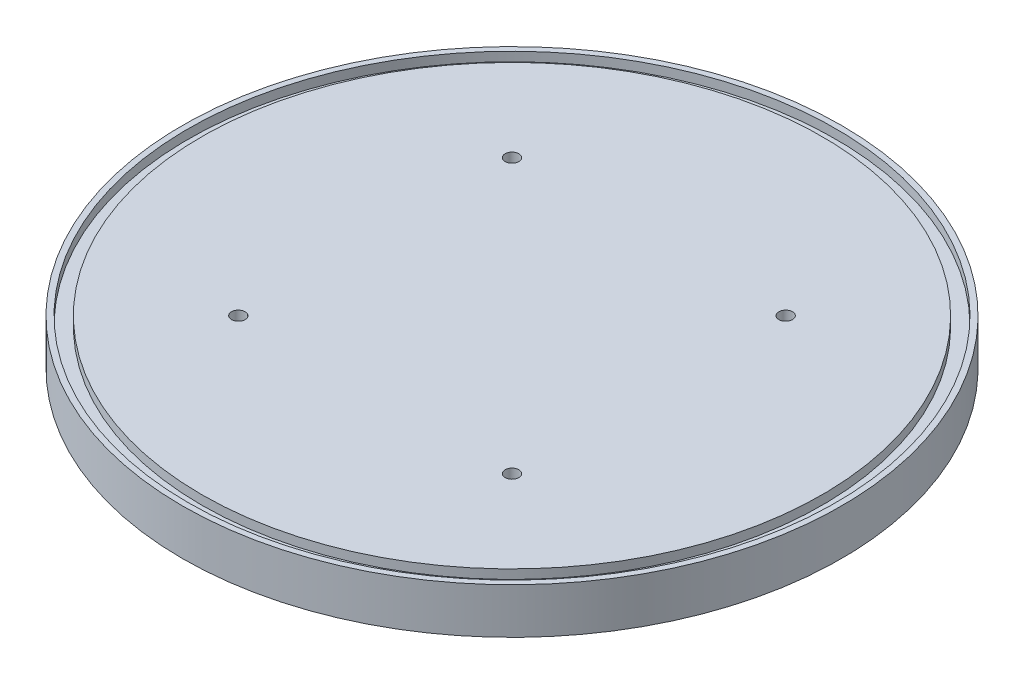
ISO-10303-21;
HEADER;
FILE_DESCRIPTION(('STEP AP214'),'2;1');
FILE_NAME('part.step','',(''),(''),'','','');
FILE_SCHEMA(('AUTOMOTIVE_DESIGN { 1 0 10303 214 1 1 1 1 }'));
ENDSEC;
DATA;
#1=APPLICATION_CONTEXT('core data for automotive mechanical design processes');
#2=APPLICATION_PROTOCOL_DEFINITION('international standard','automotive_design',2000,#1);
#3=PRODUCT_CONTEXT('',#1,'mechanical');
#4=PRODUCT('Part','Part','',(#3));
#5=PRODUCT_RELATED_PRODUCT_CATEGORY('part','',(#4));
#6=PRODUCT_DEFINITION_FORMATION('','',#4);
#7=PRODUCT_DEFINITION_CONTEXT('part definition',#1,'design');
#8=PRODUCT_DEFINITION('design','',#6,#7);
#9=PRODUCT_DEFINITION_SHAPE('','',#8);
#10=(LENGTH_UNIT() NAMED_UNIT(*) SI_UNIT(.MILLI.,.METRE.));
#11=(NAMED_UNIT(*) PLANE_ANGLE_UNIT() SI_UNIT($,.RADIAN.));
#12=(NAMED_UNIT(*) SI_UNIT($,.STERADIAN.) SOLID_ANGLE_UNIT());
#13=UNCERTAINTY_MEASURE_WITH_UNIT(LENGTH_MEASURE(1.E-05),#10,'distance_accuracy_value','');
#14=(GEOMETRIC_REPRESENTATION_CONTEXT(3) GLOBAL_UNCERTAINTY_ASSIGNED_CONTEXT((#13)) GLOBAL_UNIT_ASSIGNED_CONTEXT((#10,
#11,#12)) REPRESENTATION_CONTEXT('',''));
#15=CARTESIAN_POINT('',(0.,0.,0.));
#16=DIRECTION('',(0.,0.,1.));
#17=DIRECTION('',(1.,0.,0.));
#18=AXIS2_PLACEMENT_3D('',#15,#16,#17);
#19=CARTESIAN_POINT('',(0.,10.,0.));
#20=DIRECTION('',(0.,-1.,0.));
#21=DIRECTION('',(0.,0.,-1.));
#22=AXIS2_PLACEMENT_3D('',#19,#20,#21);
#23=CYLINDRICAL_SURFACE('',#22,72.25);
#24=CARTESIAN_POINT('',(0.,10.,0.));
#25=DIRECTION('',(0.,1.,0.));
#26=DIRECTION('',(0.,0.,1.));
#27=AXIS2_PLACEMENT_3D('',#24,#25,#26);
#28=CIRCLE('',#27,72.25);
#29=CARTESIAN_POINT('',(0.,10.,72.25));
#30=VERTEX_POINT('',#29);
#31=EDGE_CURVE('E12',#30,#30,#28,.T.);
#32=ORIENTED_EDGE('',*,*,#31,.F.);
#33=EDGE_LOOP('',(#32));
#34=FACE_BOUND('',#33,.T.);
#35=CARTESIAN_POINT('',(0.,0.,0.));
#36=DIRECTION('',(0.,1.,0.));
#37=DIRECTION('',(0.,0.,1.));
#38=AXIS2_PLACEMENT_3D('',#35,#36,#37);
#39=CIRCLE('',#38,72.25);
#40=CARTESIAN_POINT('',(0.,0.,72.25));
#41=VERTEX_POINT('',#40);
#42=EDGE_CURVE('E41',#41,#41,#39,.T.);
#43=ORIENTED_EDGE('',*,*,#42,.T.);
#44=EDGE_LOOP('',(#43));
#45=FACE_BOUND('',#44,.T.);
#46=ADVANCED_FACE('F38',(#34,#45),#23,.T.);
#47=CARTESIAN_POINT('',(0.,10.,0.));
#48=DIRECTION('',(0.,1.,0.));
#49=DIRECTION('',(0.,0.,1.));
#50=AXIS2_PLACEMENT_3D('',#47,#48,#49);
#51=PLANE('',#50);
#52=CARTESIAN_POINT('',(0.,10.,0.));
#53=DIRECTION('',(0.,1.,0.));
#54=DIRECTION('',(0.,0.,1.));
#55=AXIS2_PLACEMENT_3D('',#52,#53,#54);
#56=CIRCLE('',#55,71.);
#57=CARTESIAN_POINT('',(0.,10.,71.));
#58=VERTEX_POINT('',#57);
#59=EDGE_CURVE('E249',#58,#58,#56,.T.);
#60=ORIENTED_EDGE('',*,*,#59,.F.);
#61=EDGE_LOOP('',(#60));
#62=FACE_BOUND('',#61,.T.);
#63=ORIENTED_EDGE('',*,*,#31,.T.);
#64=EDGE_LOOP('',(#63));
#65=FACE_BOUND('',#64,.T.);
#66=ADVANCED_FACE('F101',(#62,#65),#51,.T.);
#67=CARTESIAN_POINT('',(0.,0.,0.));
#68=DIRECTION('',(0.,1.,0.));
#69=DIRECTION('',(0.,0.,1.));
#70=AXIS2_PLACEMENT_3D('',#67,#68,#69);
#71=PLANE('',#70);
#72=ORIENTED_EDGE('',*,*,#42,.F.);
#73=EDGE_LOOP('',(#72));
#74=FACE_BOUND('',#73,.T.);
#75=ADVANCED_FACE('F98',(#74),#71,.F.);
#76=CARTESIAN_POINT('',(0.,8.,0.));
#77=DIRECTION('',(0.,1.,0.));
#78=DIRECTION('',(0.,0.,1.));
#79=AXIS2_PLACEMENT_3D('',#76,#77,#78);
#80=CYLINDRICAL_SURFACE('',#79,71.);
#81=CARTESIAN_POINT('',(0.,8.,0.));
#82=DIRECTION('',(0.,1.,0.));
#83=DIRECTION('',(0.,0.,1.));
#84=AXIS2_PLACEMENT_3D('',#81,#82,#83);
#85=CIRCLE('',#84,71.);
#86=CARTESIAN_POINT('',(0.,8.,71.));
#87=VERTEX_POINT('',#86);
#88=EDGE_CURVE('E75',#87,#87,#85,.T.);
#89=ORIENTED_EDGE('',*,*,#88,.F.);
#90=EDGE_LOOP('',(#89));
#91=FACE_BOUND('',#90,.T.);
#92=ORIENTED_EDGE('',*,*,#59,.T.);
#93=EDGE_LOOP('',(#92));
#94=FACE_BOUND('',#93,.T.);
#95=ADVANCED_FACE('F100',(#91,#94),#80,.F.);
#96=CARTESIAN_POINT('',(0.,8.,0.));
#97=DIRECTION('',(0.,1.,0.));
#98=DIRECTION('',(0.,0.,1.));
#99=AXIS2_PLACEMENT_3D('',#96,#97,#98);
#100=PLANE('',#99);
#101=CARTESIAN_POINT('',(0.,8.,0.));
#102=DIRECTION('',(0.,1.,0.));
#103=DIRECTION('',(0.,0.,1.));
#104=AXIS2_PLACEMENT_3D('',#101,#102,#103);
#105=CIRCLE('',#104,68.);
#106=CARTESIAN_POINT('',(0.,8.,68.));
#107=VERTEX_POINT('',#106);
#108=EDGE_CURVE('E246',#107,#107,#105,.T.);
#109=ORIENTED_EDGE('',*,*,#108,.F.);
#110=EDGE_LOOP('',(#109));
#111=FACE_BOUND('',#110,.T.);
#112=ORIENTED_EDGE('',*,*,#88,.T.);
#113=EDGE_LOOP('',(#112));
#114=FACE_BOUND('',#113,.T.);
#115=ADVANCED_FACE('F106',(#111,#114),#100,.T.);
#116=CARTESIAN_POINT('',(0.,8.,0.));
#117=DIRECTION('',(0.,1.,0.));
#118=DIRECTION('',(0.,0.,1.));
#119=AXIS2_PLACEMENT_3D('',#116,#117,#118);
#120=CYLINDRICAL_SURFACE('',#119,68.);
#121=ORIENTED_EDGE('',*,*,#108,.T.);
#122=EDGE_LOOP('',(#121));
#123=FACE_BOUND('',#122,.T.);
#124=CARTESIAN_POINT('',(0.,10.,0.));
#125=DIRECTION('',(0.,1.,0.));
#126=DIRECTION('',(0.,0.,1.));
#127=AXIS2_PLACEMENT_3D('',#124,#125,#126);
#128=CIRCLE('',#127,68.);
#129=CARTESIAN_POINT('',(0.,10.,68.));
#130=VERTEX_POINT('',#129);
#131=EDGE_CURVE('E244',#130,#130,#128,.T.);
#132=ORIENTED_EDGE('',*,*,#131,.F.);
#133=EDGE_LOOP('',(#132));
#134=FACE_BOUND('',#133,.T.);
#135=ADVANCED_FACE('F62',(#123,#134),#120,.T.);
#136=CARTESIAN_POINT('',(-30.,4.,-30.));
#137=DIRECTION('',(0.,1.,0.));
#138=DIRECTION('',(0.,0.,1.));
#139=AXIS2_PLACEMENT_3D('',#136,#137,#138);
#140=CONICAL_SURFACE('',#139,1.5,1.02974425867665);
#141=CARTESIAN_POINT('',(-30.,3.09870907145866,-30.));
#142=VERTEX_POINT('',#141);
#143=VERTEX_LOOP('',#142);
#144=FACE_BOUND('',#143,.T.);
#145=CARTESIAN_POINT('',(-30.,4.,-30.));
#146=DIRECTION('',(0.,1.,0.));
#147=DIRECTION('',(0.,0.,1.));
#148=AXIS2_PLACEMENT_3D('',#145,#146,#147);
#149=CIRCLE('',#148,1.5);
#150=CARTESIAN_POINT('',(-30.,4.,-28.5));
#151=VERTEX_POINT('',#150);
#152=EDGE_CURVE('E66',#151,#151,#149,.T.);
#153=ORIENTED_EDGE('',*,*,#152,.T.);
#154=EDGE_LOOP('',(#153));
#155=FACE_BOUND('',#154,.T.);
#156=ADVANCED_FACE('F58',(#144,#155),#140,.F.);
#157=CARTESIAN_POINT('',(-30.0000000000003,4.,29.9999999999997));
#158=DIRECTION('',(0.,1.,0.));
#159=DIRECTION('',(0.,0.,1.));
#160=AXIS2_PLACEMENT_3D('',#157,#158,#159);
#161=CONICAL_SURFACE('',#160,1.5,1.02974425867665);
#162=CARTESIAN_POINT('',(-30.0000000000003,3.09870907145866,29.9999999999997));
#163=VERTEX_POINT('',#162);
#164=VERTEX_LOOP('',#163);
#165=FACE_BOUND('',#164,.T.);
#166=CARTESIAN_POINT('',(-30.0000000000003,4.,29.9999999999997));
#167=DIRECTION('',(0.,1.,0.));
#168=DIRECTION('',(0.,0.,1.));
#169=AXIS2_PLACEMENT_3D('',#166,#167,#168);
#170=CIRCLE('',#169,1.5);
#171=CARTESIAN_POINT('',(-30.0000000000003,4.,31.4999999999997));
#172=VERTEX_POINT('',#171);
#173=EDGE_CURVE('E72',#172,#172,#170,.T.);
#174=ORIENTED_EDGE('',*,*,#173,.T.);
#175=EDGE_LOOP('',(#174));
#176=FACE_BOUND('',#175,.T.);
#177=ADVANCED_FACE('F61',(#165,#176),#161,.F.);
#178=CARTESIAN_POINT('',(30.0000000000017,4.,29.9999999999983));
#179=DIRECTION('',(0.,1.,0.));
#180=DIRECTION('',(0.,0.,1.));
#181=AXIS2_PLACEMENT_3D('',#178,#179,#180);
#182=CONICAL_SURFACE('',#181,1.5,1.02974425867665);
#183=CARTESIAN_POINT('',(30.0000000000017,3.09870907145866,29.9999999999983));
#184=VERTEX_POINT('',#183);
#185=VERTEX_LOOP('',#184);
#186=FACE_BOUND('',#185,.T.);
#187=CARTESIAN_POINT('',(30.0000000000017,4.,29.9999999999983));
#188=DIRECTION('',(0.,1.,0.));
#189=DIRECTION('',(0.,0.,1.));
#190=AXIS2_PLACEMENT_3D('',#187,#188,#189);
#191=CIRCLE('',#190,1.5);
#192=CARTESIAN_POINT('',(30.0000000000017,4.,31.4999999999983));
#193=VERTEX_POINT('',#192);
#194=EDGE_CURVE('E84',#193,#193,#191,.T.);
#195=ORIENTED_EDGE('',*,*,#194,.T.);
#196=EDGE_LOOP('',(#195));
#197=FACE_BOUND('',#196,.T.);
#198=ADVANCED_FACE('F198',(#186,#197),#182,.F.);
#199=CARTESIAN_POINT('',(30.0000000000001,4.,-29.9999999999999));
#200=DIRECTION('',(0.,1.,0.));
#201=DIRECTION('',(0.,0.,1.));
#202=AXIS2_PLACEMENT_3D('',#199,#200,#201);
#203=CONICAL_SURFACE('',#202,1.5,1.02974425867665);
#204=CARTESIAN_POINT('',(30.0000000000001,3.09870907145866,-29.9999999999999));
#205=VERTEX_POINT('',#204);
#206=VERTEX_LOOP('',#205);
#207=FACE_BOUND('',#206,.T.);
#208=CARTESIAN_POINT('',(30.0000000000001,4.,-29.9999999999999));
#209=DIRECTION('',(0.,1.,0.));
#210=DIRECTION('',(0.,0.,1.));
#211=AXIS2_PLACEMENT_3D('',#208,#209,#210);
#212=CIRCLE('',#211,1.5);
#213=CARTESIAN_POINT('',(30.0000000000001,4.,-28.4999999999999));
#214=VERTEX_POINT('',#213);
#215=EDGE_CURVE('E90',#214,#214,#212,.T.);
#216=ORIENTED_EDGE('',*,*,#215,.T.);
#217=EDGE_LOOP('',(#216));
#218=FACE_BOUND('',#217,.T.);
#219=ADVANCED_FACE('F194',(#207,#218),#203,.F.);
#220=CARTESIAN_POINT('',(-30.,10.,-30.));
#221=DIRECTION('',(0.,1.,0.));
#222=DIRECTION('',(0.,0.,1.));
#223=AXIS2_PLACEMENT_3D('',#220,#221,#222);
#224=CYLINDRICAL_SURFACE('',#223,1.49999999999999);
#225=ORIENTED_EDGE('',*,*,#152,.F.);
#226=EDGE_LOOP('',(#225));
#227=FACE_BOUND('',#226,.T.);
#228=CARTESIAN_POINT('',(-30.,10.,-30.));
#229=DIRECTION('',(0.,1.,0.));
#230=DIRECTION('',(0.,0.,1.));
#231=AXIS2_PLACEMENT_3D('',#228,#229,#230);
#232=CIRCLE('',#231,1.49999999999999);
#233=CARTESIAN_POINT('',(-30.,10.,-28.5));
#234=VERTEX_POINT('',#233);
#235=EDGE_CURVE('E69',#234,#234,#232,.T.);
#236=ORIENTED_EDGE('',*,*,#235,.T.);
#237=EDGE_LOOP('',(#236));
#238=FACE_BOUND('',#237,.T.);
#239=ADVANCED_FACE('F129',(#227,#238),#224,.F.);
#240=CARTESIAN_POINT('',(-30.0000000000003,10.,29.9999999999997));
#241=DIRECTION('',(0.,1.,0.));
#242=DIRECTION('',(0.,0.,1.));
#243=AXIS2_PLACEMENT_3D('',#240,#241,#242);
#244=CYLINDRICAL_SURFACE('',#243,1.49999999999999);
#245=ORIENTED_EDGE('',*,*,#173,.F.);
#246=EDGE_LOOP('',(#245));
#247=FACE_BOUND('',#246,.T.);
#248=CARTESIAN_POINT('',(-30.0000000000003,10.,29.9999999999997));
#249=DIRECTION('',(0.,1.,0.));
#250=DIRECTION('',(0.,0.,1.));
#251=AXIS2_PLACEMENT_3D('',#248,#249,#250);
#252=CIRCLE('',#251,1.49999999999999);
#253=CARTESIAN_POINT('',(-30.0000000000003,10.,31.4999999999997));
#254=VERTEX_POINT('',#253);
#255=EDGE_CURVE('E68',#254,#254,#252,.T.);
#256=ORIENTED_EDGE('',*,*,#255,.T.);
#257=EDGE_LOOP('',(#256));
#258=FACE_BOUND('',#257,.T.);
#259=ADVANCED_FACE('F180',(#247,#258),#244,.F.);
#260=CARTESIAN_POINT('',(30.0000000000017,10.,29.9999999999983));
#261=DIRECTION('',(0.,1.,0.));
#262=DIRECTION('',(0.,0.,1.));
#263=AXIS2_PLACEMENT_3D('',#260,#261,#262);
#264=CYLINDRICAL_SURFACE('',#263,1.49999999999999);
#265=ORIENTED_EDGE('',*,*,#194,.F.);
#266=EDGE_LOOP('',(#265));
#267=FACE_BOUND('',#266,.T.);
#268=CARTESIAN_POINT('',(30.0000000000017,10.,29.9999999999983));
#269=DIRECTION('',(0.,1.,0.));
#270=DIRECTION('',(0.,0.,1.));
#271=AXIS2_PLACEMENT_3D('',#268,#269,#270);
#272=CIRCLE('',#271,1.49999999999999);
#273=CARTESIAN_POINT('',(30.0000000000017,10.,31.4999999999983));
#274=VERTEX_POINT('',#273);
#275=EDGE_CURVE('E81',#274,#274,#272,.T.);
#276=ORIENTED_EDGE('',*,*,#275,.T.);
#277=EDGE_LOOP('',(#276));
#278=FACE_BOUND('',#277,.T.);
#279=ADVANCED_FACE('F170',(#267,#278),#264,.F.);
#280=CARTESIAN_POINT('',(30.0000000000001,10.,-29.9999999999999));
#281=DIRECTION('',(0.,1.,0.));
#282=DIRECTION('',(0.,0.,1.));
#283=AXIS2_PLACEMENT_3D('',#280,#281,#282);
#284=CYLINDRICAL_SURFACE('',#283,1.49999999999999);
#285=ORIENTED_EDGE('',*,*,#215,.F.);
#286=EDGE_LOOP('',(#285));
#287=FACE_BOUND('',#286,.T.);
#288=CARTESIAN_POINT('',(30.0000000000001,10.,-29.9999999999999));
#289=DIRECTION('',(0.,1.,0.));
#290=DIRECTION('',(0.,0.,1.));
#291=AXIS2_PLACEMENT_3D('',#288,#289,#290);
#292=CIRCLE('',#291,1.49999999999999);
#293=CARTESIAN_POINT('',(30.0000000000001,10.,-28.4999999999999));
#294=VERTEX_POINT('',#293);
#295=EDGE_CURVE('E87',#294,#294,#292,.T.);
#296=ORIENTED_EDGE('',*,*,#295,.T.);
#297=EDGE_LOOP('',(#296));
#298=FACE_BOUND('',#297,.T.);
#299=ADVANCED_FACE('F161',(#287,#298),#284,.F.);
#300=ORIENTED_EDGE('',*,*,#295,.F.);
#301=EDGE_LOOP('',(#300));
#302=FACE_BOUND('',#301,.T.);
#303=ORIENTED_EDGE('',*,*,#275,.F.);
#304=EDGE_LOOP('',(#303));
#305=FACE_BOUND('',#304,.T.);
#306=ORIENTED_EDGE('',*,*,#255,.F.);
#307=EDGE_LOOP('',(#306));
#308=FACE_BOUND('',#307,.T.);
#309=ORIENTED_EDGE('',*,*,#235,.F.);
#310=EDGE_LOOP('',(#309));
#311=FACE_BOUND('',#310,.T.);
#312=ORIENTED_EDGE('',*,*,#131,.T.);
#313=EDGE_LOOP('',(#312));
#314=FACE_BOUND('',#313,.T.);
#315=ADVANCED_FACE('F111',(#302,#305,#308,#311,#314),#51,.T.);
#316=CLOSED_SHELL('',(#46,#66,#75,#95,#115,#135,#156,#177,#198,#219,#239,#259,#279,#299,#315));
#317=MANIFOLD_SOLID_BREP('B2',#316);
#318=ADVANCED_BREP_SHAPE_REPRESENTATION('',(#18,#317),#14);
#319=SHAPE_DEFINITION_REPRESENTATION(#9,#318);
ENDSEC;
END-ISO-10303-21;
